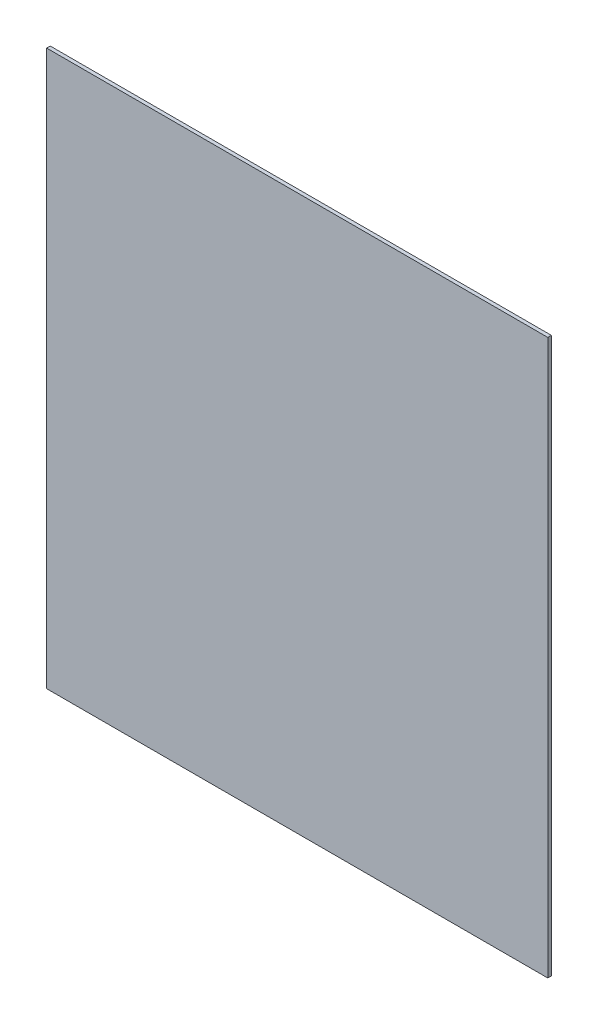
ISO-10303-21;
HEADER;
FILE_DESCRIPTION(('STEP AP214'),'2;1');
FILE_NAME('part.step','',(''),(''),'','','');
FILE_SCHEMA(('AUTOMOTIVE_DESIGN { 1 0 10303 214 1 1 1 1 }'));
ENDSEC;
DATA;
#1=APPLICATION_CONTEXT('core data for automotive mechanical design processes');
#2=APPLICATION_PROTOCOL_DEFINITION('international standard','automotive_design',2000,#1);
#3=PRODUCT_CONTEXT('',#1,'mechanical');
#4=PRODUCT('Part','Part','',(#3));
#5=PRODUCT_RELATED_PRODUCT_CATEGORY('part','',(#4));
#6=PRODUCT_DEFINITION_FORMATION('','',#4);
#7=PRODUCT_DEFINITION_CONTEXT('part definition',#1,'design');
#8=PRODUCT_DEFINITION('design','',#6,#7);
#9=PRODUCT_DEFINITION_SHAPE('','',#8);
#10=(LENGTH_UNIT() NAMED_UNIT(*) SI_UNIT(.MILLI.,.METRE.));
#11=(NAMED_UNIT(*) PLANE_ANGLE_UNIT() SI_UNIT($,.RADIAN.));
#12=(NAMED_UNIT(*) SI_UNIT($,.STERADIAN.) SOLID_ANGLE_UNIT());
#13=UNCERTAINTY_MEASURE_WITH_UNIT(LENGTH_MEASURE(1.E-05),#10,'distance_accuracy_value','');
#14=(GEOMETRIC_REPRESENTATION_CONTEXT(3) GLOBAL_UNCERTAINTY_ASSIGNED_CONTEXT((#13)) GLOBAL_UNIT_ASSIGNED_CONTEXT((#10,
#11,#12)) REPRESENTATION_CONTEXT('',''));
#15=CARTESIAN_POINT('',(0.,0.,0.));
#16=DIRECTION('',(0.,0.,1.));
#17=DIRECTION('',(1.,0.,0.));
#18=AXIS2_PLACEMENT_3D('',#15,#16,#17);
#19=CARTESIAN_POINT('',(-350.,25.0000000000002,155.));
#20=DIRECTION('',(1.,0.,0.));
#21=DIRECTION('',(0.,0.,-1.));
#22=AXIS2_PLACEMENT_3D('',#19,#20,#21);
#23=PLANE('',#22);
#24=DIRECTION('',(0.,-1.,0.));
#25=VECTOR('',#24,1.);
#26=CARTESIAN_POINT('',(-350.,25.0000000000002,150.));
#27=LINE('',#26,#25);
#28=CARTESIAN_POINT('',(-350.,25.0000000000002,150.));
#29=VERTEX_POINT('',#28);
#30=CARTESIAN_POINT('',(-350.,-750.,150.));
#31=VERTEX_POINT('',#30);
#32=EDGE_CURVE('E97',#29,#31,#27,.T.);
#33=ORIENTED_EDGE('',*,*,#32,.T.);
#34=DIRECTION('',(0.,0.,-1.));
#35=VECTOR('',#34,1.);
#36=CARTESIAN_POINT('',(-350.,-750.,155.));
#37=LINE('',#36,#35);
#38=CARTESIAN_POINT('',(-350.,-750.,155.));
#39=VERTEX_POINT('',#38);
#40=EDGE_CURVE('E11',#39,#31,#37,.T.);
#41=ORIENTED_EDGE('',*,*,#40,.F.);
#42=DIRECTION('',(0.,-1.,0.));
#43=VECTOR('',#42,1.);
#44=CARTESIAN_POINT('',(-350.,25.0000000000002,155.));
#45=LINE('',#44,#43);
#46=CARTESIAN_POINT('',(-350.,25.0000000000002,155.));
#47=VERTEX_POINT('',#46);
#48=EDGE_CURVE('E85',#47,#39,#45,.T.);
#49=ORIENTED_EDGE('',*,*,#48,.F.);
#50=DIRECTION('',(0.,0.,-1.));
#51=VECTOR('',#50,1.);
#52=CARTESIAN_POINT('',(-350.,25.0000000000002,155.));
#53=LINE('',#52,#51);
#54=EDGE_CURVE('E93',#47,#29,#53,.T.);
#55=ORIENTED_EDGE('',*,*,#54,.T.);
#56=EDGE_LOOP('',(#33,#41,#49,#55));
#57=FACE_BOUND('',#56,.T.);
#58=ADVANCED_FACE('F34',(#57),#23,.F.);
#59=CARTESIAN_POINT('',(-350.,-750.,155.));
#60=DIRECTION('',(0.,1.,0.));
#61=DIRECTION('',(0.,0.,1.));
#62=AXIS2_PLACEMENT_3D('',#59,#60,#61);
#63=PLANE('',#62);
#64=DIRECTION('',(1.,0.,0.));
#65=VECTOR('',#64,1.);
#66=CARTESIAN_POINT('',(-350.,-750.,150.));
#67=LINE('',#66,#65);
#68=CARTESIAN_POINT('',(350.,-750.,150.));
#69=VERTEX_POINT('',#68);
#70=EDGE_CURVE('E89',#31,#69,#67,.T.);
#71=ORIENTED_EDGE('',*,*,#70,.T.);
#72=DIRECTION('',(0.,0.,-1.));
#73=VECTOR('',#72,1.);
#74=CARTESIAN_POINT('',(350.,-750.,155.));
#75=LINE('',#74,#73);
#76=CARTESIAN_POINT('',(350.,-750.,155.));
#77=VERTEX_POINT('',#76);
#78=EDGE_CURVE('E42',#77,#69,#75,.T.);
#79=ORIENTED_EDGE('',*,*,#78,.F.);
#80=DIRECTION('',(1.,0.,0.));
#81=VECTOR('',#80,1.);
#82=CARTESIAN_POINT('',(-350.,-750.,155.));
#83=LINE('',#82,#81);
#84=EDGE_CURVE('E80',#39,#77,#83,.T.);
#85=ORIENTED_EDGE('',*,*,#84,.F.);
#86=ORIENTED_EDGE('',*,*,#40,.T.);
#87=EDGE_LOOP('',(#71,#79,#85,#86));
#88=FACE_BOUND('',#87,.T.);
#89=ADVANCED_FACE('F88',(#88),#63,.F.);
#90=CARTESIAN_POINT('',(350.,25.0000000000002,155.));
#91=DIRECTION('',(-1.,0.,0.));
#92=DIRECTION('',(0.,0.,1.));
#93=AXIS2_PLACEMENT_3D('',#90,#91,#92);
#94=PLANE('',#93);
#95=DIRECTION('',(0.,1.,0.));
#96=VECTOR('',#95,1.);
#97=CARTESIAN_POINT('',(350.,25.0000000000002,150.));
#98=LINE('',#97,#96);
#99=CARTESIAN_POINT('',(350.,25.0000000000002,150.));
#100=VERTEX_POINT('',#99);
#101=EDGE_CURVE('E67',#69,#100,#98,.T.);
#102=ORIENTED_EDGE('',*,*,#101,.T.);
#103=DIRECTION('',(0.,0.,-1.));
#104=VECTOR('',#103,1.);
#105=CARTESIAN_POINT('',(350.,25.0000000000002,155.));
#106=LINE('',#105,#104);
#107=CARTESIAN_POINT('',(350.,25.0000000000002,155.));
#108=VERTEX_POINT('',#107);
#109=EDGE_CURVE('E90',#108,#100,#106,.T.);
#110=ORIENTED_EDGE('',*,*,#109,.F.);
#111=DIRECTION('',(0.,1.,0.));
#112=VECTOR('',#111,1.);
#113=CARTESIAN_POINT('',(350.,25.0000000000002,155.));
#114=LINE('',#113,#112);
#115=EDGE_CURVE('E83',#77,#108,#114,.T.);
#116=ORIENTED_EDGE('',*,*,#115,.F.);
#117=ORIENTED_EDGE('',*,*,#78,.T.);
#118=EDGE_LOOP('',(#102,#110,#116,#117));
#119=FACE_BOUND('',#118,.T.);
#120=ADVANCED_FACE('F91',(#119),#94,.F.);
#121=CARTESIAN_POINT('',(-350.,25.0000000000002,155.));
#122=DIRECTION('',(0.,-1.,0.));
#123=DIRECTION('',(0.,0.,-1.));
#124=AXIS2_PLACEMENT_3D('',#121,#122,#123);
#125=PLANE('',#124);
#126=DIRECTION('',(-1.,0.,0.));
#127=VECTOR('',#126,1.);
#128=CARTESIAN_POINT('',(-350.,25.0000000000002,150.));
#129=LINE('',#128,#127);
#130=EDGE_CURVE('E73',#100,#29,#129,.T.);
#131=ORIENTED_EDGE('',*,*,#130,.T.);
#132=ORIENTED_EDGE('',*,*,#54,.F.);
#133=DIRECTION('',(-1.,0.,0.));
#134=VECTOR('',#133,1.);
#135=CARTESIAN_POINT('',(-350.,25.0000000000002,155.));
#136=LINE('',#135,#134);
#137=EDGE_CURVE('E50',#108,#47,#136,.T.);
#138=ORIENTED_EDGE('',*,*,#137,.F.);
#139=ORIENTED_EDGE('',*,*,#109,.T.);
#140=EDGE_LOOP('',(#131,#132,#138,#139));
#141=FACE_BOUND('',#140,.T.);
#142=ADVANCED_FACE('F104',(#141),#125,.F.);
#143=CARTESIAN_POINT('',(0.,0.,155.));
#144=DIRECTION('',(0.,0.,1.));
#145=DIRECTION('',(1.,0.,0.));
#146=AXIS2_PLACEMENT_3D('',#143,#144,#145);
#147=PLANE('',#146);
#148=ORIENTED_EDGE('',*,*,#48,.T.);
#149=ORIENTED_EDGE('',*,*,#84,.T.);
#150=ORIENTED_EDGE('',*,*,#115,.T.);
#151=ORIENTED_EDGE('',*,*,#137,.T.);
#152=EDGE_LOOP('',(#148,#149,#150,#151));
#153=FACE_BOUND('',#152,.T.);
#154=ADVANCED_FACE('F81',(#153),#147,.T.);
#155=CARTESIAN_POINT('',(0.,0.,150.));
#156=DIRECTION('',(0.,0.,1.));
#157=DIRECTION('',(1.,0.,0.));
#158=AXIS2_PLACEMENT_3D('',#155,#156,#157);
#159=PLANE('',#158);
#160=ORIENTED_EDGE('',*,*,#32,.F.);
#161=ORIENTED_EDGE('',*,*,#130,.F.);
#162=ORIENTED_EDGE('',*,*,#101,.F.);
#163=ORIENTED_EDGE('',*,*,#70,.F.);
#164=EDGE_LOOP('',(#160,#161,#162,#163));
#165=FACE_BOUND('',#164,.T.);
#166=ADVANCED_FACE('F107',(#165),#159,.F.);
#167=CLOSED_SHELL('',(#58,#89,#120,#142,#154,#166));
#168=MANIFOLD_SOLID_BREP('B2',#167);
#169=ADVANCED_BREP_SHAPE_REPRESENTATION('',(#18,#168),#14);
#170=SHAPE_DEFINITION_REPRESENTATION(#9,#169);
ENDSEC;
END-ISO-10303-21;
